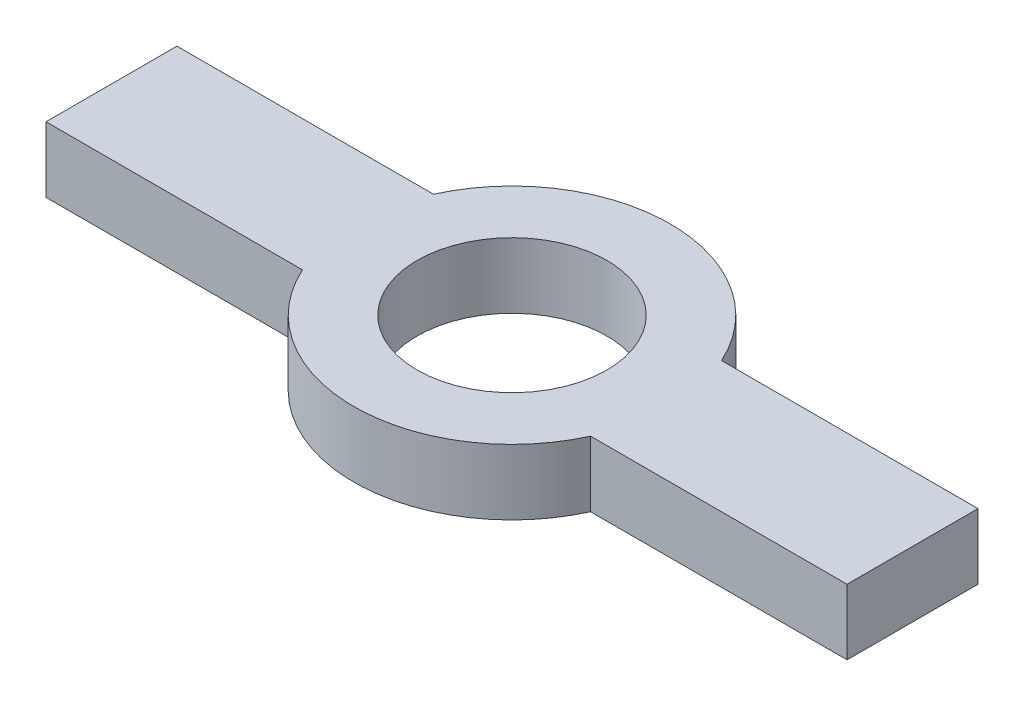
ISO-10303-21;
HEADER;
FILE_DESCRIPTION(('STEP AP214'),'2;1');
FILE_NAME('part.step','',(''),(''),'','','');
FILE_SCHEMA(('AUTOMOTIVE_DESIGN { 1 0 10303 214 1 1 1 1 }'));
ENDSEC;
DATA;
#1=APPLICATION_CONTEXT('core data for automotive mechanical design processes');
#2=APPLICATION_PROTOCOL_DEFINITION('international standard','automotive_design',2000,#1);
#3=PRODUCT_CONTEXT('',#1,'mechanical');
#4=PRODUCT('Part','Part','',(#3));
#5=PRODUCT_RELATED_PRODUCT_CATEGORY('part','',(#4));
#6=PRODUCT_DEFINITION_FORMATION('','',#4);
#7=PRODUCT_DEFINITION_CONTEXT('part definition',#1,'design');
#8=PRODUCT_DEFINITION('design','',#6,#7);
#9=PRODUCT_DEFINITION_SHAPE('','',#8);
#10=(LENGTH_UNIT() NAMED_UNIT(*) SI_UNIT(.MILLI.,.METRE.));
#11=(NAMED_UNIT(*) PLANE_ANGLE_UNIT() SI_UNIT($,.RADIAN.));
#12=(NAMED_UNIT(*) SI_UNIT($,.STERADIAN.) SOLID_ANGLE_UNIT());
#13=UNCERTAINTY_MEASURE_WITH_UNIT(LENGTH_MEASURE(1.E-05),#10,'distance_accuracy_value','');
#14=(GEOMETRIC_REPRESENTATION_CONTEXT(3) GLOBAL_UNCERTAINTY_ASSIGNED_CONTEXT((#13)) GLOBAL_UNIT_ASSIGNED_CONTEXT((#10,
#11,#12)) REPRESENTATION_CONTEXT('',''));
#15=CARTESIAN_POINT('',(0.,0.,0.));
#16=DIRECTION('',(0.,0.,1.));
#17=DIRECTION('',(1.,0.,0.));
#18=AXIS2_PLACEMENT_3D('',#15,#16,#17);
#19=CARTESIAN_POINT('',(0.,3.,0.));
#20=DIRECTION('',(0.,-1.,0.));
#21=DIRECTION('',(0.,0.,-1.));
#22=AXIS2_PLACEMENT_3D('',#19,#20,#21);
#23=CYLINDRICAL_SURFACE('',#22,7.25);
#24=DIRECTION('',(0.,-1.,0.));
#25=VECTOR('',#24,1.);
#26=CARTESIAN_POINT('',(-6.60018939122204,3.,-3.));
#27=LINE('',#26,#25);
#28=CARTESIAN_POINT('',(-6.60018939122204,3.,-3.));
#29=VERTEX_POINT('',#28);
#30=CARTESIAN_POINT('',(-6.60018939122204,0.,-3.));
#31=VERTEX_POINT('',#30);
#32=EDGE_CURVE('E11',#29,#31,#27,.T.);
#33=ORIENTED_EDGE('',*,*,#32,.F.);
#34=CARTESIAN_POINT('',(0.,3.,0.));
#35=DIRECTION('',(0.,1.,0.));
#36=DIRECTION('',(0.,0.,1.));
#37=AXIS2_PLACEMENT_3D('',#34,#35,#36);
#38=CIRCLE('',#37,7.25);
#39=CARTESIAN_POINT('',(6.60018939122204,3.,-3.));
#40=VERTEX_POINT('',#39);
#41=EDGE_CURVE('E110',#40,#29,#38,.T.);
#42=ORIENTED_EDGE('',*,*,#41,.F.);
#43=DIRECTION('',(0.,-1.,0.));
#44=VECTOR('',#43,1.);
#45=CARTESIAN_POINT('',(6.60018939122204,3.,-3.));
#46=LINE('',#45,#44);
#47=CARTESIAN_POINT('',(6.60018939122204,0.,-3.));
#48=VERTEX_POINT('',#47);
#49=EDGE_CURVE('E167',#40,#48,#46,.T.);
#50=ORIENTED_EDGE('',*,*,#49,.T.);
#51=CARTESIAN_POINT('',(0.,0.,0.));
#52=DIRECTION('',(0.,1.,0.));
#53=DIRECTION('',(0.,0.,1.));
#54=AXIS2_PLACEMENT_3D('',#51,#52,#53);
#55=CIRCLE('',#54,7.25);
#56=EDGE_CURVE('E51',#48,#31,#55,.T.);
#57=ORIENTED_EDGE('',*,*,#56,.T.);
#58=EDGE_LOOP('',(#33,#42,#50,#57));
#59=FACE_BOUND('',#58,.T.);
#60=ADVANCED_FACE('F36',(#59),#23,.T.);
#61=CARTESIAN_POINT('',(0.,3.,0.));
#62=DIRECTION('',(0.,1.,0.));
#63=DIRECTION('',(0.,0.,1.));
#64=AXIS2_PLACEMENT_3D('',#61,#62,#63);
#65=PLANE('',#64);
#66=CARTESIAN_POINT('',(0.,3.,0.));
#67=DIRECTION('',(0.,1.,0.));
#68=DIRECTION('',(0.,0.,1.));
#69=AXIS2_PLACEMENT_3D('',#66,#67,#68);
#70=CIRCLE('',#69,4.35);
#71=CARTESIAN_POINT('',(0.,3.,4.35));
#72=VERTEX_POINT('',#71);
#73=EDGE_CURVE('E156',#72,#72,#70,.T.);
#74=ORIENTED_EDGE('',*,*,#73,.F.);
#75=EDGE_LOOP('',(#74));
#76=FACE_BOUND('',#75,.T.);
#77=ORIENTED_EDGE('',*,*,#41,.T.);
#78=DIRECTION('',(-1.,0.,0.));
#79=VECTOR('',#78,1.);
#80=CARTESIAN_POINT('',(0.,3.,-3.));
#81=LINE('',#80,#79);
#82=CARTESIAN_POINT('',(-18.35,3.,-3.));
#83=VERTEX_POINT('',#82);
#84=EDGE_CURVE('E102',#29,#83,#81,.T.);
#85=ORIENTED_EDGE('',*,*,#84,.T.);
#86=DIRECTION('',(0.,0.,1.));
#87=VECTOR('',#86,1.);
#88=CARTESIAN_POINT('',(-18.35,3.,0.));
#89=LINE('',#88,#87);
#90=CARTESIAN_POINT('',(-18.35,3.,3.));
#91=VERTEX_POINT('',#90);
#92=EDGE_CURVE('E107',#83,#91,#89,.T.);
#93=ORIENTED_EDGE('',*,*,#92,.T.);
#94=DIRECTION('',(-1.,0.,0.));
#95=VECTOR('',#94,1.);
#96=CARTESIAN_POINT('',(0.,3.,3.));
#97=LINE('',#96,#95);
#98=CARTESIAN_POINT('',(-6.60018939122204,3.,3.));
#99=VERTEX_POINT('',#98);
#100=EDGE_CURVE('E127',#99,#91,#97,.T.);
#101=ORIENTED_EDGE('',*,*,#100,.F.);
#102=CARTESIAN_POINT('',(6.60018939122204,3.,3.));
#103=VERTEX_POINT('',#102);
#104=EDGE_CURVE('E58',#99,#103,#38,.T.);
#105=ORIENTED_EDGE('',*,*,#104,.T.);
#106=DIRECTION('',(1.,0.,0.));
#107=VECTOR('',#106,1.);
#108=CARTESIAN_POINT('',(0.,3.,3.));
#109=LINE('',#108,#107);
#110=CARTESIAN_POINT('',(18.35,3.,3.));
#111=VERTEX_POINT('',#110);
#112=EDGE_CURVE('E142',#103,#111,#109,.T.);
#113=ORIENTED_EDGE('',*,*,#112,.T.);
#114=DIRECTION('',(0.,0.,1.));
#115=VECTOR('',#114,1.);
#116=CARTESIAN_POINT('',(18.35,3.,0.));
#117=LINE('',#116,#115);
#118=CARTESIAN_POINT('',(18.35,3.,-3.));
#119=VERTEX_POINT('',#118);
#120=EDGE_CURVE('E136',#119,#111,#117,.T.);
#121=ORIENTED_EDGE('',*,*,#120,.F.);
#122=DIRECTION('',(1.,0.,0.));
#123=VECTOR('',#122,1.);
#124=CARTESIAN_POINT('',(0.,3.,-3.));
#125=LINE('',#124,#123);
#126=EDGE_CURVE('E139',#40,#119,#125,.T.);
#127=ORIENTED_EDGE('',*,*,#126,.F.);
#128=EDGE_LOOP('',(#77,#85,#93,#101,#105,#113,#121,#127));
#129=FACE_BOUND('',#128,.T.);
#130=ADVANCED_FACE('F104',(#76,#129),#65,.T.);
#131=CARTESIAN_POINT('',(0.,0.,0.));
#132=DIRECTION('',(0.,1.,0.));
#133=DIRECTION('',(0.,0.,1.));
#134=AXIS2_PLACEMENT_3D('',#131,#132,#133);
#135=PLANE('',#134);
#136=CARTESIAN_POINT('',(0.,0.,0.));
#137=DIRECTION('',(0.,1.,0.));
#138=DIRECTION('',(0.,0.,1.));
#139=AXIS2_PLACEMENT_3D('',#136,#137,#138);
#140=CIRCLE('',#139,4.35);
#141=CARTESIAN_POINT('',(0.,0.,4.35));
#142=VERTEX_POINT('',#141);
#143=EDGE_CURVE('E155',#142,#142,#140,.T.);
#144=ORIENTED_EDGE('',*,*,#143,.T.);
#145=EDGE_LOOP('',(#144));
#146=FACE_BOUND('',#145,.T.);
#147=DIRECTION('',(-1.,0.,0.));
#148=VECTOR('',#147,1.);
#149=CARTESIAN_POINT('',(0.,0.,-3.));
#150=LINE('',#149,#148);
#151=CARTESIAN_POINT('',(-18.35,0.,-3.));
#152=VERTEX_POINT('',#151);
#153=EDGE_CURVE('E118',#31,#152,#150,.T.);
#154=ORIENTED_EDGE('',*,*,#153,.F.);
#155=ORIENTED_EDGE('',*,*,#56,.F.);
#156=DIRECTION('',(1.,0.,0.));
#157=VECTOR('',#156,1.);
#158=CARTESIAN_POINT('',(0.,0.,-3.));
#159=LINE('',#158,#157);
#160=CARTESIAN_POINT('',(18.35,0.,-3.));
#161=VERTEX_POINT('',#160);
#162=EDGE_CURVE('E147',#48,#161,#159,.T.);
#163=ORIENTED_EDGE('',*,*,#162,.T.);
#164=DIRECTION('',(0.,0.,1.));
#165=VECTOR('',#164,1.);
#166=CARTESIAN_POINT('',(18.35,0.,0.));
#167=LINE('',#166,#165);
#168=CARTESIAN_POINT('',(18.35,0.,3.));
#169=VERTEX_POINT('',#168);
#170=EDGE_CURVE('E122',#161,#169,#167,.T.);
#171=ORIENTED_EDGE('',*,*,#170,.T.);
#172=DIRECTION('',(1.,0.,0.));
#173=VECTOR('',#172,1.);
#174=CARTESIAN_POINT('',(0.,0.,3.));
#175=LINE('',#174,#173);
#176=CARTESIAN_POINT('',(6.60018939122204,0.,3.));
#177=VERTEX_POINT('',#176);
#178=EDGE_CURVE('E140',#177,#169,#175,.T.);
#179=ORIENTED_EDGE('',*,*,#178,.F.);
#180=CARTESIAN_POINT('',(-6.60018939122204,0.,3.));
#181=VERTEX_POINT('',#180);
#182=EDGE_CURVE('E159',#181,#177,#55,.T.);
#183=ORIENTED_EDGE('',*,*,#182,.F.);
#184=DIRECTION('',(-1.,0.,0.));
#185=VECTOR('',#184,1.);
#186=CARTESIAN_POINT('',(0.,0.,3.));
#187=LINE('',#186,#185);
#188=CARTESIAN_POINT('',(-18.35,0.,3.));
#189=VERTEX_POINT('',#188);
#190=EDGE_CURVE('E112',#181,#189,#187,.T.);
#191=ORIENTED_EDGE('',*,*,#190,.T.);
#192=DIRECTION('',(0.,0.,1.));
#193=VECTOR('',#192,1.);
#194=CARTESIAN_POINT('',(-18.35,0.,0.));
#195=LINE('',#194,#193);
#196=EDGE_CURVE('E132',#152,#189,#195,.T.);
#197=ORIENTED_EDGE('',*,*,#196,.F.);
#198=EDGE_LOOP('',(#154,#155,#163,#171,#179,#183,#191,#197));
#199=FACE_BOUND('',#198,.T.);
#200=ADVANCED_FACE('F172',(#146,#199),#135,.F.);
#201=ORIENTED_EDGE('',*,*,#104,.F.);
#202=DIRECTION('',(0.,-1.,0.));
#203=VECTOR('',#202,1.);
#204=CARTESIAN_POINT('',(-6.60018939122204,3.,3.));
#205=LINE('',#204,#203);
#206=EDGE_CURVE('E44',#99,#181,#205,.T.);
#207=ORIENTED_EDGE('',*,*,#206,.T.);
#208=ORIENTED_EDGE('',*,*,#182,.T.);
#209=DIRECTION('',(0.,-1.,0.));
#210=VECTOR('',#209,1.);
#211=CARTESIAN_POINT('',(6.60018939122204,3.,3.));
#212=LINE('',#211,#210);
#213=EDGE_CURVE('E163',#103,#177,#212,.T.);
#214=ORIENTED_EDGE('',*,*,#213,.F.);
#215=EDGE_LOOP('',(#201,#207,#208,#214));
#216=FACE_BOUND('',#215,.T.);
#217=ADVANCED_FACE('F38',(#216),#23,.T.);
#218=CARTESIAN_POINT('',(0.,3.,0.));
#219=DIRECTION('',(0.,-1.,0.));
#220=DIRECTION('',(0.,0.,-1.));
#221=AXIS2_PLACEMENT_3D('',#218,#219,#220);
#222=CYLINDRICAL_SURFACE('',#221,4.35);
#223=ORIENTED_EDGE('',*,*,#143,.F.);
#224=EDGE_LOOP('',(#223));
#225=FACE_BOUND('',#224,.T.);
#226=ORIENTED_EDGE('',*,*,#73,.T.);
#227=EDGE_LOOP('',(#226));
#228=FACE_BOUND('',#227,.T.);
#229=ADVANCED_FACE('F194',(#225,#228),#222,.F.);
#230=CARTESIAN_POINT('',(0.,3.,-3.));
#231=DIRECTION('',(0.,0.,-1.));
#232=DIRECTION('',(-1.,0.,0.));
#233=AXIS2_PLACEMENT_3D('',#230,#231,#232);
#234=PLANE('',#233);
#235=ORIENTED_EDGE('',*,*,#49,.F.);
#236=ORIENTED_EDGE('',*,*,#126,.T.);
#237=DIRECTION('',(0.,-1.,0.));
#238=VECTOR('',#237,1.);
#239=CARTESIAN_POINT('',(18.35,3.,-3.));
#240=LINE('',#239,#238);
#241=EDGE_CURVE('E152',#119,#161,#240,.T.);
#242=ORIENTED_EDGE('',*,*,#241,.T.);
#243=ORIENTED_EDGE('',*,*,#162,.F.);
#244=EDGE_LOOP('',(#235,#236,#242,#243));
#245=FACE_BOUND('',#244,.T.);
#246=ADVANCED_FACE('F185',(#245),#234,.T.);
#247=CARTESIAN_POINT('',(0.,3.,3.));
#248=DIRECTION('',(0.,0.,-1.));
#249=DIRECTION('',(-1.,0.,0.));
#250=AXIS2_PLACEMENT_3D('',#247,#248,#249);
#251=PLANE('',#250);
#252=ORIENTED_EDGE('',*,*,#112,.F.);
#253=ORIENTED_EDGE('',*,*,#213,.T.);
#254=ORIENTED_EDGE('',*,*,#178,.T.);
#255=DIRECTION('',(0.,-1.,0.));
#256=VECTOR('',#255,1.);
#257=CARTESIAN_POINT('',(18.35,3.,3.));
#258=LINE('',#257,#256);
#259=EDGE_CURVE('E144',#111,#169,#258,.T.);
#260=ORIENTED_EDGE('',*,*,#259,.F.);
#261=EDGE_LOOP('',(#252,#253,#254,#260));
#262=FACE_BOUND('',#261,.T.);
#263=ADVANCED_FACE('F178',(#262),#251,.F.);
#264=CARTESIAN_POINT('',(18.35,3.,0.));
#265=DIRECTION('',(1.,0.,0.));
#266=DIRECTION('',(0.,0.,-1.));
#267=AXIS2_PLACEMENT_3D('',#264,#265,#266);
#268=PLANE('',#267);
#269=ORIENTED_EDGE('',*,*,#170,.F.);
#270=ORIENTED_EDGE('',*,*,#241,.F.);
#271=ORIENTED_EDGE('',*,*,#120,.T.);
#272=ORIENTED_EDGE('',*,*,#259,.T.);
#273=EDGE_LOOP('',(#269,#270,#271,#272));
#274=FACE_BOUND('',#273,.T.);
#275=ADVANCED_FACE('F180',(#274),#268,.T.);
#276=CARTESIAN_POINT('',(0.,3.,-3.));
#277=DIRECTION('',(0.,0.,1.));
#278=DIRECTION('',(1.,0.,0.));
#279=AXIS2_PLACEMENT_3D('',#276,#277,#278);
#280=PLANE('',#279);
#281=ORIENTED_EDGE('',*,*,#84,.F.);
#282=ORIENTED_EDGE('',*,*,#32,.T.);
#283=ORIENTED_EDGE('',*,*,#153,.T.);
#284=DIRECTION('',(0.,-1.,0.));
#285=VECTOR('',#284,1.);
#286=CARTESIAN_POINT('',(-18.35,3.,-3.));
#287=LINE('',#286,#285);
#288=EDGE_CURVE('E115',#83,#152,#287,.T.);
#289=ORIENTED_EDGE('',*,*,#288,.F.);
#290=EDGE_LOOP('',(#281,#282,#283,#289));
#291=FACE_BOUND('',#290,.T.);
#292=ADVANCED_FACE('F116',(#291),#280,.F.);
#293=CARTESIAN_POINT('',(0.,3.,3.));
#294=DIRECTION('',(0.,0.,1.));
#295=DIRECTION('',(1.,0.,0.));
#296=AXIS2_PLACEMENT_3D('',#293,#294,#295);
#297=PLANE('',#296);
#298=ORIENTED_EDGE('',*,*,#206,.F.);
#299=ORIENTED_EDGE('',*,*,#100,.T.);
#300=DIRECTION('',(0.,-1.,0.));
#301=VECTOR('',#300,1.);
#302=CARTESIAN_POINT('',(-18.35,3.,3.));
#303=LINE('',#302,#301);
#304=EDGE_CURVE('E123',#91,#189,#303,.T.);
#305=ORIENTED_EDGE('',*,*,#304,.T.);
#306=ORIENTED_EDGE('',*,*,#190,.F.);
#307=EDGE_LOOP('',(#298,#299,#305,#306));
#308=FACE_BOUND('',#307,.T.);
#309=ADVANCED_FACE('F170',(#308),#297,.T.);
#310=CARTESIAN_POINT('',(-18.35,3.,0.));
#311=DIRECTION('',(1.,0.,0.));
#312=DIRECTION('',(0.,0.,-1.));
#313=AXIS2_PLACEMENT_3D('',#310,#311,#312);
#314=PLANE('',#313);
#315=ORIENTED_EDGE('',*,*,#196,.T.);
#316=ORIENTED_EDGE('',*,*,#304,.F.);
#317=ORIENTED_EDGE('',*,*,#92,.F.);
#318=ORIENTED_EDGE('',*,*,#288,.T.);
#319=EDGE_LOOP('',(#315,#316,#317,#318));
#320=FACE_BOUND('',#319,.T.);
#321=ADVANCED_FACE('F125',(#320),#314,.F.);
#322=CLOSED_SHELL('',(#60,#130,#200,#217,#229,#246,#263,#275,#292,#309,#321));
#323=MANIFOLD_SOLID_BREP('B2',#322);
#324=ADVANCED_BREP_SHAPE_REPRESENTATION('',(#18,#323),#14);
#325=SHAPE_DEFINITION_REPRESENTATION(#9,#324);
ENDSEC;
END-ISO-10303-21;
